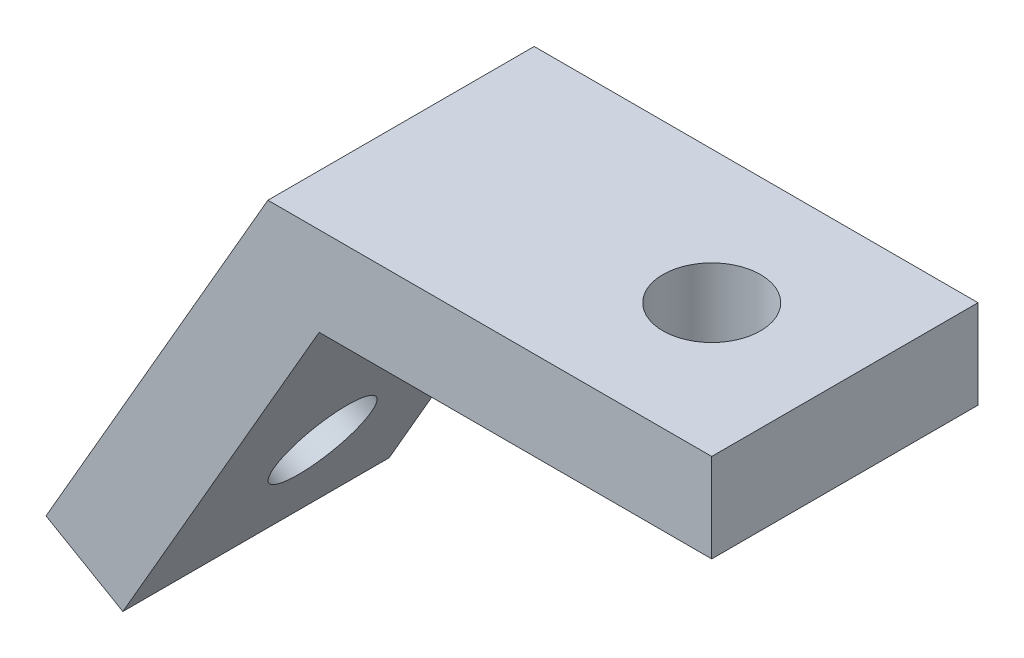
ISO-10303-21;
HEADER;
FILE_DESCRIPTION(('STEP AP214'),'2;1');
FILE_NAME('part.step','',(''),(''),'','','');
FILE_SCHEMA(('AUTOMOTIVE_DESIGN { 1 0 10303 214 1 1 1 1 }'));
ENDSEC;
DATA;
#1=APPLICATION_CONTEXT('core data for automotive mechanical design processes');
#2=APPLICATION_PROTOCOL_DEFINITION('international standard','automotive_design',2000,#1);
#3=PRODUCT_CONTEXT('',#1,'mechanical');
#4=PRODUCT('Part','Part','',(#3));
#5=PRODUCT_RELATED_PRODUCT_CATEGORY('part','',(#4));
#6=PRODUCT_DEFINITION_FORMATION('','',#4);
#7=PRODUCT_DEFINITION_CONTEXT('part definition',#1,'design');
#8=PRODUCT_DEFINITION('design','',#6,#7);
#9=PRODUCT_DEFINITION_SHAPE('','',#8);
#10=(LENGTH_UNIT() NAMED_UNIT(*) SI_UNIT(.MILLI.,.METRE.));
#11=(NAMED_UNIT(*) PLANE_ANGLE_UNIT() SI_UNIT($,.RADIAN.));
#12=(NAMED_UNIT(*) SI_UNIT($,.STERADIAN.) SOLID_ANGLE_UNIT());
#13=UNCERTAINTY_MEASURE_WITH_UNIT(LENGTH_MEASURE(1.E-05),#10,'distance_accuracy_value','');
#14=(GEOMETRIC_REPRESENTATION_CONTEXT(3) GLOBAL_UNCERTAINTY_ASSIGNED_CONTEXT((#13)) GLOBAL_UNIT_ASSIGNED_CONTEXT((#10,
#11,#12)) REPRESENTATION_CONTEXT('',''));
#15=CARTESIAN_POINT('',(0.,0.,0.));
#16=DIRECTION('',(0.,0.,1.));
#17=DIRECTION('',(1.,0.,0.));
#18=AXIS2_PLACEMENT_3D('',#15,#16,#17);
#19=CARTESIAN_POINT('',(10.1757541962075,2.4712060373322,6.));
#20=DIRECTION('',(-1.,0.,0.));
#21=DIRECTION('',(0.,0.,1.));
#22=AXIS2_PLACEMENT_3D('',#19,#20,#21);
#23=PLANE('',#22);
#24=DIRECTION('',(0.,1.,0.));
#25=VECTOR('',#24,1.);
#26=CARTESIAN_POINT('',(10.1757541962075,2.4712060373322,0.));
#27=LINE('',#26,#25);
#28=CARTESIAN_POINT('',(10.1757541962075,2.4712060373322,0.));
#29=VERTEX_POINT('',#28);
#30=CARTESIAN_POINT('',(10.1757541962075,4.4712060373322,0.));
#31=VERTEX_POINT('',#30);
#32=EDGE_CURVE('E129',#29,#31,#27,.T.);
#33=ORIENTED_EDGE('',*,*,#32,.T.);
#34=DIRECTION('',(0.,0.,-1.));
#35=VECTOR('',#34,1.);
#36=CARTESIAN_POINT('',(10.1757541962075,4.4712060373322,6.));
#37=LINE('',#36,#35);
#38=CARTESIAN_POINT('',(10.1757541962075,4.4712060373322,6.));
#39=VERTEX_POINT('',#38);
#40=EDGE_CURVE('E11',#39,#31,#37,.T.);
#41=ORIENTED_EDGE('',*,*,#40,.F.);
#42=DIRECTION('',(0.,1.,0.));
#43=VECTOR('',#42,1.);
#44=CARTESIAN_POINT('',(10.1757541962075,2.4712060373322,6.));
#45=LINE('',#44,#43);
#46=CARTESIAN_POINT('',(10.1757541962075,2.4712060373322,6.));
#47=VERTEX_POINT('',#46);
#48=EDGE_CURVE('E146',#47,#39,#45,.T.);
#49=ORIENTED_EDGE('',*,*,#48,.F.);
#50=DIRECTION('',(0.,0.,-1.));
#51=VECTOR('',#50,1.);
#52=CARTESIAN_POINT('',(10.1757541962075,2.4712060373322,6.));
#53=LINE('',#52,#51);
#54=EDGE_CURVE('E125',#47,#29,#53,.T.);
#55=ORIENTED_EDGE('',*,*,#54,.T.);
#56=EDGE_LOOP('',(#33,#41,#49,#55));
#57=FACE_BOUND('',#56,.T.);
#58=ADVANCED_FACE('F38',(#57),#23,.F.);
#59=CARTESIAN_POINT('',(10.1757541962075,4.4712060373322,6.));
#60=DIRECTION('',(0.,-1.,0.));
#61=DIRECTION('',(1.,0.,0.));
#62=AXIS2_PLACEMENT_3D('',#59,#60,#61);
#63=PLANE('',#62);
#64=CARTESIAN_POINT('',(7.17575419620749,4.4712060373322,3.));
#65=DIRECTION('',(0.,1.,0.));
#66=DIRECTION('',(-1.,0.,0.));
#67=AXIS2_PLACEMENT_3D('',#64,#65,#66);
#68=CIRCLE('',#67,1.1);
#69=CARTESIAN_POINT('',(6.07575419620749,4.4712060373322,3.));
#70=VERTEX_POINT('',#69);
#71=EDGE_CURVE('E157',#70,#70,#68,.T.);
#72=ORIENTED_EDGE('',*,*,#71,.F.);
#73=EDGE_LOOP('',(#72));
#74=FACE_BOUND('',#73,.T.);
#75=DIRECTION('',(-1.,0.,0.));
#76=VECTOR('',#75,1.);
#77=CARTESIAN_POINT('',(10.1757541962075,4.4712060373322,0.));
#78=LINE('',#77,#76);
#79=CARTESIAN_POINT('',(0.175754196207488,4.4712060373322,0.));
#80=VERTEX_POINT('',#79);
#81=EDGE_CURVE('E133',#31,#80,#78,.T.);
#82=ORIENTED_EDGE('',*,*,#81,.T.);
#83=DIRECTION('',(0.,0.,-1.));
#84=VECTOR('',#83,1.);
#85=CARTESIAN_POINT('',(0.175754196207488,4.4712060373322,6.));
#86=LINE('',#85,#84);
#87=CARTESIAN_POINT('',(0.175754196207488,4.4712060373322,6.));
#88=VERTEX_POINT('',#87);
#89=EDGE_CURVE('E48',#88,#80,#86,.T.);
#90=ORIENTED_EDGE('',*,*,#89,.F.);
#91=DIRECTION('',(-1.,0.,0.));
#92=VECTOR('',#91,1.);
#93=CARTESIAN_POINT('',(10.1757541962075,4.4712060373322,6.));
#94=LINE('',#93,#92);
#95=EDGE_CURVE('E94',#39,#88,#94,.T.);
#96=ORIENTED_EDGE('',*,*,#95,.F.);
#97=ORIENTED_EDGE('',*,*,#40,.T.);
#98=EDGE_LOOP('',(#82,#90,#96,#97));
#99=FACE_BOUND('',#98,.T.);
#100=ADVANCED_FACE('F176',(#74,#99),#63,.F.);
#101=CARTESIAN_POINT('',(0.175754196207488,4.4712060373322,6.));
#102=DIRECTION('',(0.86602540378444,-0.499999999999998,0.));
#103=DIRECTION('',(0.499999999999998,0.86602540378444,0.));
#104=AXIS2_PLACEMENT_3D('',#101,#102,#103);
#105=PLANE('',#104);
#106=CARTESIAN_POINT('',(-3.3242458037925,-1.59097178915888,3.));
#107=DIRECTION('',(-0.86602540378444,0.499999999999998,0.));
#108=DIRECTION('',(-0.499999999999998,-0.86602540378444,0.));
#109=AXIS2_PLACEMENT_3D('',#106,#107,#108);
#110=CIRCLE('',#109,1.1);
#111=CARTESIAN_POINT('',(-3.87424580379249,-2.54359973332177,3.));
#112=VERTEX_POINT('',#111);
#113=EDGE_CURVE('E167',#112,#112,#110,.T.);
#114=ORIENTED_EDGE('',*,*,#113,.F.);
#115=EDGE_LOOP('',(#114));
#116=FACE_BOUND('',#115,.T.);
#117=DIRECTION('',(-0.499999999999998,-0.86602540378444,0.));
#118=VECTOR('',#117,1.);
#119=CARTESIAN_POINT('',(0.175754196207488,4.4712060373322,0.));
#120=LINE('',#119,#118);
#121=CARTESIAN_POINT('',(-4.82424580379249,-4.18904800051221,0.));
#122=VERTEX_POINT('',#121);
#123=EDGE_CURVE('E137',#80,#122,#120,.T.);
#124=ORIENTED_EDGE('',*,*,#123,.T.);
#125=DIRECTION('',(0.,0.,-1.));
#126=VECTOR('',#125,1.);
#127=CARTESIAN_POINT('',(-4.82424580379249,-4.18904800051221,6.));
#128=LINE('',#127,#126);
#129=CARTESIAN_POINT('',(-4.82424580379249,-4.18904800051221,6.));
#130=VERTEX_POINT('',#129);
#131=EDGE_CURVE('E118',#130,#122,#128,.T.);
#132=ORIENTED_EDGE('',*,*,#131,.F.);
#133=DIRECTION('',(-0.499999999999998,-0.86602540378444,0.));
#134=VECTOR('',#133,1.);
#135=CARTESIAN_POINT('',(0.175754196207488,4.4712060373322,6.));
#136=LINE('',#135,#134);
#137=EDGE_CURVE('E107',#88,#130,#136,.T.);
#138=ORIENTED_EDGE('',*,*,#137,.F.);
#139=ORIENTED_EDGE('',*,*,#89,.T.);
#140=EDGE_LOOP('',(#124,#132,#138,#139));
#141=FACE_BOUND('',#140,.T.);
#142=ADVANCED_FACE('F179',(#116,#141),#105,.F.);
#143=CARTESIAN_POINT('',(-4.82424580379249,-4.18904800051221,6.));
#144=DIRECTION('',(0.499999999999997,0.86602540378444,0.));
#145=DIRECTION('',(-0.86602540378444,0.499999999999997,0.));
#146=AXIS2_PLACEMENT_3D('',#143,#144,#145);
#147=PLANE('',#146);
#148=DIRECTION('',(0.86602540378444,-0.499999999999997,0.));
#149=VECTOR('',#148,1.);
#150=CARTESIAN_POINT('',(-4.82424580379249,-4.18904800051221,0.));
#151=LINE('',#150,#149);
#152=CARTESIAN_POINT('',(-3.09219499622361,-5.1890480005122,0.));
#153=VERTEX_POINT('',#152);
#154=EDGE_CURVE('E116',#122,#153,#151,.T.);
#155=ORIENTED_EDGE('',*,*,#154,.T.);
#156=DIRECTION('',(0.,0.,-1.));
#157=VECTOR('',#156,1.);
#158=CARTESIAN_POINT('',(-3.09219499622361,-5.1890480005122,6.));
#159=LINE('',#158,#157);
#160=CARTESIAN_POINT('',(-3.09219499622361,-5.1890480005122,6.));
#161=VERTEX_POINT('',#160);
#162=EDGE_CURVE('E113',#161,#153,#159,.T.);
#163=ORIENTED_EDGE('',*,*,#162,.F.);
#164=DIRECTION('',(0.86602540378444,-0.499999999999997,0.));
#165=VECTOR('',#164,1.);
#166=CARTESIAN_POINT('',(-4.82424580379249,-4.18904800051221,6.));
#167=LINE('',#166,#165);
#168=EDGE_CURVE('E101',#130,#161,#167,.T.);
#169=ORIENTED_EDGE('',*,*,#168,.F.);
#170=ORIENTED_EDGE('',*,*,#131,.T.);
#171=EDGE_LOOP('',(#155,#163,#169,#170));
#172=FACE_BOUND('',#171,.T.);
#173=ADVANCED_FACE('F114',(#172),#147,.F.);
#174=CARTESIAN_POINT('',(-3.09219499622361,-5.1890480005122,6.));
#175=DIRECTION('',(-0.86602540378444,0.499999999999997,0.));
#176=DIRECTION('',(-0.499999999999997,-0.86602540378444,0.));
#177=AXIS2_PLACEMENT_3D('',#174,#175,#176);
#178=PLANE('',#177);
#179=CARTESIAN_POINT('',(-1.59219499622362,-2.59097178915888,3.));
#180=DIRECTION('',(-0.86602540378444,0.499999999999997,0.));
#181=DIRECTION('',(-0.499999999999997,-0.86602540378444,0.));
#182=AXIS2_PLACEMENT_3D('',#179,#180,#181);
#183=CIRCLE('',#182,1.1);
#184=CARTESIAN_POINT('',(-2.14219499622361,-3.54359973332176,3.));
#185=VERTEX_POINT('',#184);
#186=EDGE_CURVE('E41',#185,#185,#183,.T.);
#187=ORIENTED_EDGE('',*,*,#186,.T.);
#188=EDGE_LOOP('',(#187));
#189=FACE_BOUND('',#188,.T.);
#190=DIRECTION('',(0.499999999999997,0.86602540378444,0.));
#191=VECTOR('',#190,1.);
#192=CARTESIAN_POINT('',(-3.09219499622361,-5.1890480005122,0.));
#193=LINE('',#192,#191);
#194=CARTESIAN_POINT('',(1.33045473458674,2.4712060373322,0.));
#195=VERTEX_POINT('',#194);
#196=EDGE_CURVE('E80',#153,#195,#193,.T.);
#197=ORIENTED_EDGE('',*,*,#196,.T.);
#198=DIRECTION('',(0.,0.,-1.));
#199=VECTOR('',#198,1.);
#200=CARTESIAN_POINT('',(1.33045473458674,2.4712060373322,6.));
#201=LINE('',#200,#199);
#202=CARTESIAN_POINT('',(1.33045473458674,2.4712060373322,6.));
#203=VERTEX_POINT('',#202);
#204=EDGE_CURVE('E119',#203,#195,#201,.T.);
#205=ORIENTED_EDGE('',*,*,#204,.F.);
#206=DIRECTION('',(0.499999999999997,0.86602540378444,0.));
#207=VECTOR('',#206,1.);
#208=CARTESIAN_POINT('',(-3.09219499622361,-5.1890480005122,6.));
#209=LINE('',#208,#207);
#210=EDGE_CURVE('E105',#161,#203,#209,.T.);
#211=ORIENTED_EDGE('',*,*,#210,.F.);
#212=ORIENTED_EDGE('',*,*,#162,.T.);
#213=EDGE_LOOP('',(#197,#205,#211,#212));
#214=FACE_BOUND('',#213,.T.);
#215=ADVANCED_FACE('F121',(#189,#214),#178,.F.);
#216=CARTESIAN_POINT('',(1.33045473458674,2.4712060373322,6.));
#217=DIRECTION('',(0.,1.,0.));
#218=DIRECTION('',(-1.,0.,0.));
#219=AXIS2_PLACEMENT_3D('',#216,#217,#218);
#220=PLANE('',#219);
#221=CARTESIAN_POINT('',(7.17575419620749,2.4712060373322,3.));
#222=DIRECTION('',(0.,1.,0.));
#223=DIRECTION('',(-1.,0.,0.));
#224=AXIS2_PLACEMENT_3D('',#221,#222,#223);
#225=CIRCLE('',#224,1.1);
#226=CARTESIAN_POINT('',(6.07575419620749,2.4712060373322,3.));
#227=VERTEX_POINT('',#226);
#228=EDGE_CURVE('E134',#227,#227,#225,.T.);
#229=ORIENTED_EDGE('',*,*,#228,.T.);
#230=EDGE_LOOP('',(#229));
#231=FACE_BOUND('',#230,.T.);
#232=DIRECTION('',(1.,0.,0.));
#233=VECTOR('',#232,1.);
#234=CARTESIAN_POINT('',(1.33045473458674,2.4712060373322,0.));
#235=LINE('',#234,#233);
#236=EDGE_CURVE('E86',#195,#29,#235,.T.);
#237=ORIENTED_EDGE('',*,*,#236,.T.);
#238=ORIENTED_EDGE('',*,*,#54,.F.);
#239=DIRECTION('',(1.,0.,0.));
#240=VECTOR('',#239,1.);
#241=CARTESIAN_POINT('',(1.33045473458674,2.4712060373322,6.));
#242=LINE('',#241,#240);
#243=EDGE_CURVE('E57',#203,#47,#242,.T.);
#244=ORIENTED_EDGE('',*,*,#243,.F.);
#245=ORIENTED_EDGE('',*,*,#204,.T.);
#246=EDGE_LOOP('',(#237,#238,#244,#245));
#247=FACE_BOUND('',#246,.T.);
#248=ADVANCED_FACE('F184',(#231,#247),#220,.F.);
#249=CARTESIAN_POINT('',(0.,0.,6.));
#250=DIRECTION('',(0.,0.,1.));
#251=DIRECTION('',(1.,0.,0.));
#252=AXIS2_PLACEMENT_3D('',#249,#250,#251);
#253=PLANE('',#252);
#254=ORIENTED_EDGE('',*,*,#48,.T.);
#255=ORIENTED_EDGE('',*,*,#95,.T.);
#256=ORIENTED_EDGE('',*,*,#137,.T.);
#257=ORIENTED_EDGE('',*,*,#168,.T.);
#258=ORIENTED_EDGE('',*,*,#210,.T.);
#259=ORIENTED_EDGE('',*,*,#243,.T.);
#260=EDGE_LOOP('',(#254,#255,#256,#257,#258,#259));
#261=FACE_BOUND('',#260,.T.);
#262=ADVANCED_FACE('F103',(#261),#253,.T.);
#263=CARTESIAN_POINT('',(0.,0.,0.));
#264=DIRECTION('',(0.,0.,1.));
#265=DIRECTION('',(1.,0.,0.));
#266=AXIS2_PLACEMENT_3D('',#263,#264,#265);
#267=PLANE('',#266);
#268=ORIENTED_EDGE('',*,*,#32,.F.);
#269=ORIENTED_EDGE('',*,*,#236,.F.);
#270=ORIENTED_EDGE('',*,*,#196,.F.);
#271=ORIENTED_EDGE('',*,*,#154,.F.);
#272=ORIENTED_EDGE('',*,*,#123,.F.);
#273=ORIENTED_EDGE('',*,*,#81,.F.);
#274=EDGE_LOOP('',(#268,#269,#270,#271,#272,#273));
#275=FACE_BOUND('',#274,.T.);
#276=ADVANCED_FACE('F182',(#275),#267,.F.);
#277=CARTESIAN_POINT('',(7.17575419620749,-1.5287939626678,3.));
#278=DIRECTION('',(0.,1.,0.));
#279=DIRECTION('',(-1.,0.,0.));
#280=AXIS2_PLACEMENT_3D('',#277,#278,#279);
#281=CYLINDRICAL_SURFACE('',#280,1.1);
#282=ORIENTED_EDGE('',*,*,#71,.T.);
#283=EDGE_LOOP('',(#282));
#284=FACE_BOUND('',#283,.T.);
#285=ORIENTED_EDGE('',*,*,#228,.F.);
#286=EDGE_LOOP('',(#285));
#287=FACE_BOUND('',#286,.T.);
#288=ADVANCED_FACE('F234',(#284,#287),#281,.F.);
#289=CARTESIAN_POINT('',(1.87190661891414,-4.59097178915887,3.));
#290=DIRECTION('',(-0.86602540378444,0.499999999999998,0.));
#291=DIRECTION('',(-0.499999999999998,-0.86602540378444,0.));
#292=AXIS2_PLACEMENT_3D('',#289,#290,#291);
#293=CYLINDRICAL_SURFACE('',#292,1.1);
#294=ORIENTED_EDGE('',*,*,#113,.T.);
#295=EDGE_LOOP('',(#294));
#296=FACE_BOUND('',#295,.T.);
#297=ORIENTED_EDGE('',*,*,#186,.F.);
#298=EDGE_LOOP('',(#297));
#299=FACE_BOUND('',#298,.T.);
#300=ADVANCED_FACE('F239',(#296,#299),#293,.F.);
#301=CLOSED_SHELL('',(#58,#100,#142,#173,#215,#248,#262,#276,#288,#300));
#302=MANIFOLD_SOLID_BREP('B2',#301);
#303=ADVANCED_BREP_SHAPE_REPRESENTATION('',(#18,#302),#14);
#304=SHAPE_DEFINITION_REPRESENTATION(#9,#303);
ENDSEC;
END-ISO-10303-21;
